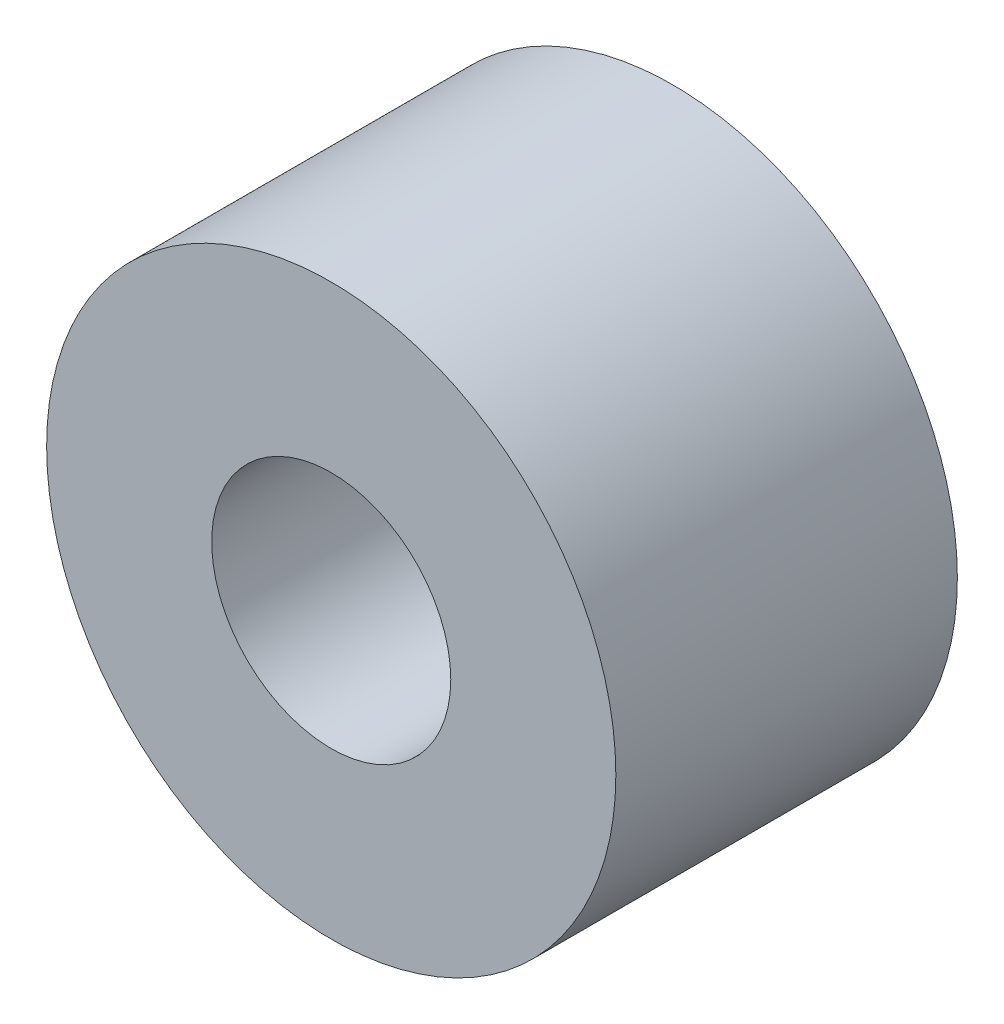
ISO-10303-21;
HEADER;
FILE_DESCRIPTION(('STEP AP214'),'2;1');
FILE_NAME('part.step','',(''),(''),'','','');
FILE_SCHEMA(('AUTOMOTIVE_DESIGN { 1 0 10303 214 1 1 1 1 }'));
ENDSEC;
DATA;
#1=APPLICATION_CONTEXT('core data for automotive mechanical design processes');
#2=APPLICATION_PROTOCOL_DEFINITION('international standard','automotive_design',2000,#1);
#3=PRODUCT_CONTEXT('',#1,'mechanical');
#4=PRODUCT('Part','Part','',(#3));
#5=PRODUCT_RELATED_PRODUCT_CATEGORY('part','',(#4));
#6=PRODUCT_DEFINITION_FORMATION('','',#4);
#7=PRODUCT_DEFINITION_CONTEXT('part definition',#1,'design');
#8=PRODUCT_DEFINITION('design','',#6,#7);
#9=PRODUCT_DEFINITION_SHAPE('','',#8);
#10=(LENGTH_UNIT() NAMED_UNIT(*) SI_UNIT(.MILLI.,.METRE.));
#11=(NAMED_UNIT(*) PLANE_ANGLE_UNIT() SI_UNIT($,.RADIAN.));
#12=(NAMED_UNIT(*) SI_UNIT($,.STERADIAN.) SOLID_ANGLE_UNIT());
#13=UNCERTAINTY_MEASURE_WITH_UNIT(LENGTH_MEASURE(1.E-05),#10,'distance_accuracy_value','');
#14=(GEOMETRIC_REPRESENTATION_CONTEXT(3) GLOBAL_UNCERTAINTY_ASSIGNED_CONTEXT((#13)) GLOBAL_UNIT_ASSIGNED_CONTEXT((#10,
#11,#12)) REPRESENTATION_CONTEXT('',''));
#15=CARTESIAN_POINT('',(0.,0.,0.));
#16=DIRECTION('',(0.,0.,1.));
#17=DIRECTION('',(1.,0.,0.));
#18=AXIS2_PLACEMENT_3D('',#15,#16,#17);
#19=CARTESIAN_POINT('',(0.,0.,12.));
#20=DIRECTION('',(0.,0.,1.));
#21=DIRECTION('',(1.,0.,0.));
#22=AXIS2_PLACEMENT_3D('',#19,#20,#21);
#23=PLANE('',#22);
#24=CARTESIAN_POINT('',(0.,0.,12.));
#25=DIRECTION('',(0.,0.,1.));
#26=DIRECTION('',(1.,0.,0.));
#27=AXIS2_PLACEMENT_3D('',#24,#25,#26);
#28=CIRCLE('',#27,10.);
#29=CARTESIAN_POINT('',(10.,0.,12.));
#30=VERTEX_POINT('',#29);
#31=EDGE_CURVE('E10',#30,#30,#28,.T.);
#32=ORIENTED_EDGE('',*,*,#31,.T.);
#33=EDGE_LOOP('',(#32));
#34=FACE_BOUND('',#33,.T.);
#35=CARTESIAN_POINT('',(0.,0.,12.));
#36=DIRECTION('',(0.,0.,1.));
#37=DIRECTION('',(1.,0.,0.));
#38=AXIS2_PLACEMENT_3D('',#35,#36,#37);
#39=CIRCLE('',#38,4.2);
#40=CARTESIAN_POINT('',(4.2,0.,12.));
#41=VERTEX_POINT('',#40);
#42=EDGE_CURVE('E48',#41,#41,#39,.T.);
#43=ORIENTED_EDGE('',*,*,#42,.F.);
#44=EDGE_LOOP('',(#43));
#45=FACE_BOUND('',#44,.T.);
#46=ADVANCED_FACE('F37',(#34,#45),#23,.T.);
#47=CARTESIAN_POINT('',(0.,0.,0.));
#48=DIRECTION('',(0.,0.,1.));
#49=DIRECTION('',(1.,0.,0.));
#50=AXIS2_PLACEMENT_3D('',#47,#48,#49);
#51=PLANE('',#50);
#52=CARTESIAN_POINT('',(0.,0.,0.));
#53=DIRECTION('',(0.,0.,1.));
#54=DIRECTION('',(1.,0.,0.));
#55=AXIS2_PLACEMENT_3D('',#52,#53,#54);
#56=CIRCLE('',#55,10.);
#57=CARTESIAN_POINT('',(10.,0.,0.));
#58=VERTEX_POINT('',#57);
#59=EDGE_CURVE('E41',#58,#58,#56,.T.);
#60=ORIENTED_EDGE('',*,*,#59,.F.);
#61=EDGE_LOOP('',(#60));
#62=FACE_BOUND('',#61,.T.);
#63=CARTESIAN_POINT('',(0.,0.,0.));
#64=DIRECTION('',(0.,0.,1.));
#65=DIRECTION('',(1.,0.,0.));
#66=AXIS2_PLACEMENT_3D('',#63,#64,#65);
#67=CIRCLE('',#66,4.2);
#68=CARTESIAN_POINT('',(4.2,0.,0.));
#69=VERTEX_POINT('',#68);
#70=EDGE_CURVE('E50',#69,#69,#67,.T.);
#71=ORIENTED_EDGE('',*,*,#70,.T.);
#72=EDGE_LOOP('',(#71));
#73=FACE_BOUND('',#72,.T.);
#74=ADVANCED_FACE('F60',(#62,#73),#51,.F.);
#75=CARTESIAN_POINT('',(0.,0.,12.));
#76=DIRECTION('',(0.,0.,-1.));
#77=DIRECTION('',(-1.,0.,0.));
#78=AXIS2_PLACEMENT_3D('',#75,#76,#77);
#79=CYLINDRICAL_SURFACE('',#78,10.);
#80=ORIENTED_EDGE('',*,*,#31,.F.);
#81=EDGE_LOOP('',(#80));
#82=FACE_BOUND('',#81,.T.);
#83=ORIENTED_EDGE('',*,*,#59,.T.);
#84=EDGE_LOOP('',(#83));
#85=FACE_BOUND('',#84,.T.);
#86=ADVANCED_FACE('F39',(#82,#85),#79,.T.);
#87=CARTESIAN_POINT('',(0.,0.,12.));
#88=DIRECTION('',(0.,0.,-1.));
#89=DIRECTION('',(-1.,0.,0.));
#90=AXIS2_PLACEMENT_3D('',#87,#88,#89);
#91=CYLINDRICAL_SURFACE('',#90,4.2);
#92=ORIENTED_EDGE('',*,*,#42,.T.);
#93=EDGE_LOOP('',(#92));
#94=FACE_BOUND('',#93,.T.);
#95=ORIENTED_EDGE('',*,*,#70,.F.);
#96=EDGE_LOOP('',(#95));
#97=FACE_BOUND('',#96,.T.);
#98=ADVANCED_FACE('F56',(#94,#97),#91,.F.);
#99=CLOSED_SHELL('',(#46,#74,#86,#98));
#100=MANIFOLD_SOLID_BREP('B2',#99);
#101=ADVANCED_BREP_SHAPE_REPRESENTATION('',(#18,#100),#14);
#102=SHAPE_DEFINITION_REPRESENTATION(#9,#101);
ENDSEC;
END-ISO-10303-21;
